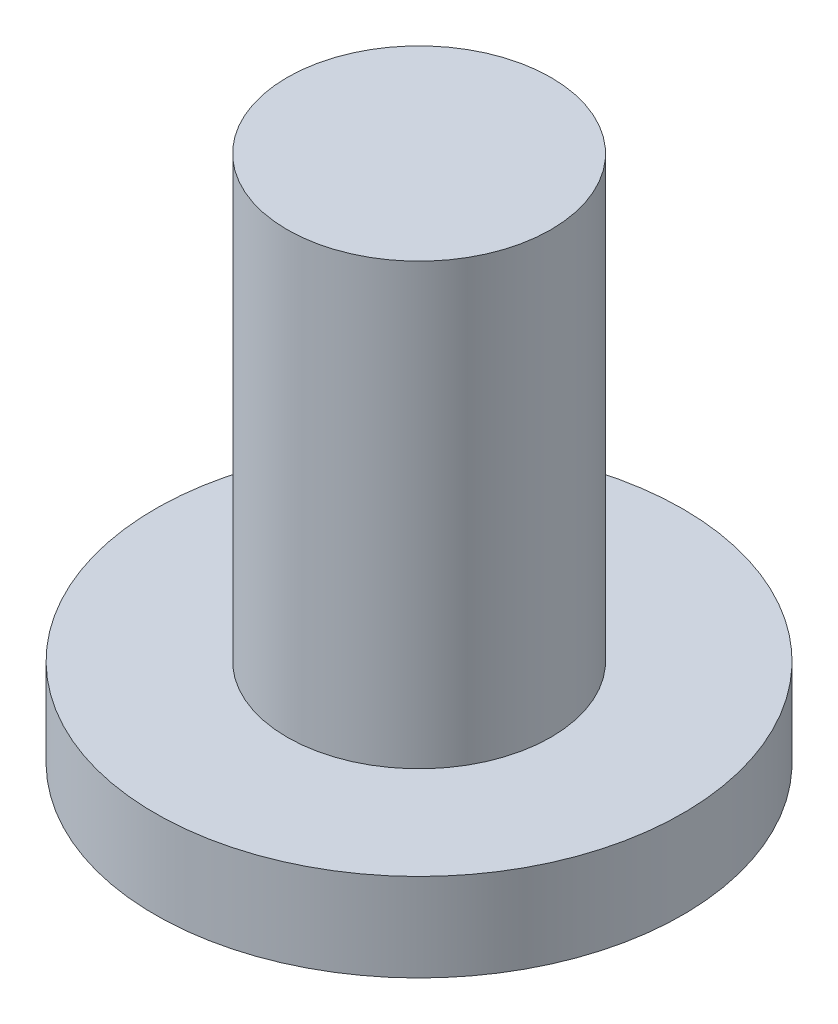
ISO-10303-21;
HEADER;
FILE_DESCRIPTION(('STEP AP214'),'2;1');
FILE_NAME('part.step','',(''),(''),'','','');
FILE_SCHEMA(('AUTOMOTIVE_DESIGN { 1 0 10303 214 1 1 1 1 }'));
ENDSEC;
DATA;
#1=APPLICATION_CONTEXT('core data for automotive mechanical design processes');
#2=APPLICATION_PROTOCOL_DEFINITION('international standard','automotive_design',2000,#1);
#3=PRODUCT_CONTEXT('',#1,'mechanical');
#4=PRODUCT('Part','Part','',(#3));
#5=PRODUCT_RELATED_PRODUCT_CATEGORY('part','',(#4));
#6=PRODUCT_DEFINITION_FORMATION('','',#4);
#7=PRODUCT_DEFINITION_CONTEXT('part definition',#1,'design');
#8=PRODUCT_DEFINITION('design','',#6,#7);
#9=PRODUCT_DEFINITION_SHAPE('','',#8);
#10=(LENGTH_UNIT() NAMED_UNIT(*) SI_UNIT(.MILLI.,.METRE.));
#11=(NAMED_UNIT(*) PLANE_ANGLE_UNIT() SI_UNIT($,.RADIAN.));
#12=(NAMED_UNIT(*) SI_UNIT($,.STERADIAN.) SOLID_ANGLE_UNIT());
#13=UNCERTAINTY_MEASURE_WITH_UNIT(LENGTH_MEASURE(1.E-05),#10,'distance_accuracy_value','');
#14=(GEOMETRIC_REPRESENTATION_CONTEXT(3) GLOBAL_UNCERTAINTY_ASSIGNED_CONTEXT((#13)) GLOBAL_UNIT_ASSIGNED_CONTEXT((#10,
#11,#12)) REPRESENTATION_CONTEXT('',''));
#15=CARTESIAN_POINT('',(0.,0.,0.));
#16=DIRECTION('',(0.,0.,1.));
#17=DIRECTION('',(1.,0.,0.));
#18=AXIS2_PLACEMENT_3D('',#15,#16,#17);
#19=CARTESIAN_POINT('',(0.,5.,0.));
#20=DIRECTION('',(0.,-1.,0.));
#21=DIRECTION('',(0.,0.,-1.));
#22=AXIS2_PLACEMENT_3D('',#19,#20,#21);
#23=CYLINDRICAL_SURFACE('',#22,3.);
#24=CARTESIAN_POINT('',(0.,5.,0.));
#25=DIRECTION('',(0.,1.,0.));
#26=DIRECTION('',(0.,0.,1.));
#27=AXIS2_PLACEMENT_3D('',#24,#25,#26);
#28=CIRCLE('',#27,3.);
#29=CARTESIAN_POINT('',(0.,5.,3.));
#30=VERTEX_POINT('',#29);
#31=EDGE_CURVE('E10',#30,#30,#28,.T.);
#32=ORIENTED_EDGE('',*,*,#31,.F.);
#33=EDGE_LOOP('',(#32));
#34=FACE_BOUND('',#33,.T.);
#35=CARTESIAN_POINT('',(0.,-5.,0.));
#36=DIRECTION('',(0.,1.,0.));
#37=DIRECTION('',(0.,0.,1.));
#38=AXIS2_PLACEMENT_3D('',#35,#36,#37);
#39=CIRCLE('',#38,3.);
#40=CARTESIAN_POINT('',(0.,-5.,3.));
#41=VERTEX_POINT('',#40);
#42=EDGE_CURVE('E46',#41,#41,#39,.T.);
#43=ORIENTED_EDGE('',*,*,#42,.T.);
#44=EDGE_LOOP('',(#43));
#45=FACE_BOUND('',#44,.T.);
#46=ADVANCED_FACE('F43',(#34,#45),#23,.T.);
#47=CARTESIAN_POINT('',(0.,5.,0.));
#48=DIRECTION('',(0.,1.,0.));
#49=DIRECTION('',(0.,0.,1.));
#50=AXIS2_PLACEMENT_3D('',#47,#48,#49);
#51=PLANE('',#50);
#52=ORIENTED_EDGE('',*,*,#31,.T.);
#53=EDGE_LOOP('',(#52));
#54=FACE_BOUND('',#53,.T.);
#55=ADVANCED_FACE('F70',(#54),#51,.T.);
#56=CARTESIAN_POINT('',(0.,-7.,0.));
#57=DIRECTION('',(0.,1.,0.));
#58=DIRECTION('',(0.,0.,1.));
#59=AXIS2_PLACEMENT_3D('',#56,#57,#58);
#60=CYLINDRICAL_SURFACE('',#59,6.);
#61=CARTESIAN_POINT('',(0.,-7.,0.));
#62=DIRECTION('',(0.,-1.,0.));
#63=DIRECTION('',(0.,0.,-1.));
#64=AXIS2_PLACEMENT_3D('',#61,#62,#63);
#65=CIRCLE('',#64,6.);
#66=CARTESIAN_POINT('',(0.,-7.,-6.));
#67=VERTEX_POINT('',#66);
#68=EDGE_CURVE('E55',#67,#67,#65,.T.);
#69=ORIENTED_EDGE('',*,*,#68,.F.);
#70=EDGE_LOOP('',(#69));
#71=FACE_BOUND('',#70,.T.);
#72=CARTESIAN_POINT('',(0.,-5.,0.));
#73=DIRECTION('',(0.,-1.,0.));
#74=DIRECTION('',(0.,0.,-1.));
#75=AXIS2_PLACEMENT_3D('',#72,#73,#74);
#76=CIRCLE('',#75,6.);
#77=CARTESIAN_POINT('',(0.,-5.,-6.));
#78=VERTEX_POINT('',#77);
#79=EDGE_CURVE('E57',#78,#78,#76,.T.);
#80=ORIENTED_EDGE('',*,*,#79,.T.);
#81=EDGE_LOOP('',(#80));
#82=FACE_BOUND('',#81,.T.);
#83=ADVANCED_FACE('F67',(#71,#82),#60,.T.);
#84=CARTESIAN_POINT('',(0.,-7.,0.));
#85=DIRECTION('',(0.,-1.,0.));
#86=DIRECTION('',(0.,0.,-1.));
#87=AXIS2_PLACEMENT_3D('',#84,#85,#86);
#88=PLANE('',#87);
#89=ORIENTED_EDGE('',*,*,#68,.T.);
#90=EDGE_LOOP('',(#89));
#91=FACE_BOUND('',#90,.T.);
#92=ADVANCED_FACE('F65',(#91),#88,.T.);
#93=CARTESIAN_POINT('',(0.,-5.,0.));
#94=DIRECTION('',(0.,-1.,0.));
#95=DIRECTION('',(0.,0.,-1.));
#96=AXIS2_PLACEMENT_3D('',#93,#94,#95);
#97=PLANE('',#96);
#98=ORIENTED_EDGE('',*,*,#42,.F.);
#99=EDGE_LOOP('',(#98));
#100=FACE_BOUND('',#99,.T.);
#101=ORIENTED_EDGE('',*,*,#79,.F.);
#102=EDGE_LOOP('',(#101));
#103=FACE_BOUND('',#102,.T.);
#104=ADVANCED_FACE('F74',(#100,#103),#97,.F.);
#105=CLOSED_SHELL('',(#46,#55,#83,#92,#104));
#106=MANIFOLD_SOLID_BREP('B2',#105);
#107=ADVANCED_BREP_SHAPE_REPRESENTATION('',(#18,#106),#14);
#108=SHAPE_DEFINITION_REPRESENTATION(#9,#107);
ENDSEC;
END-ISO-10303-21;
